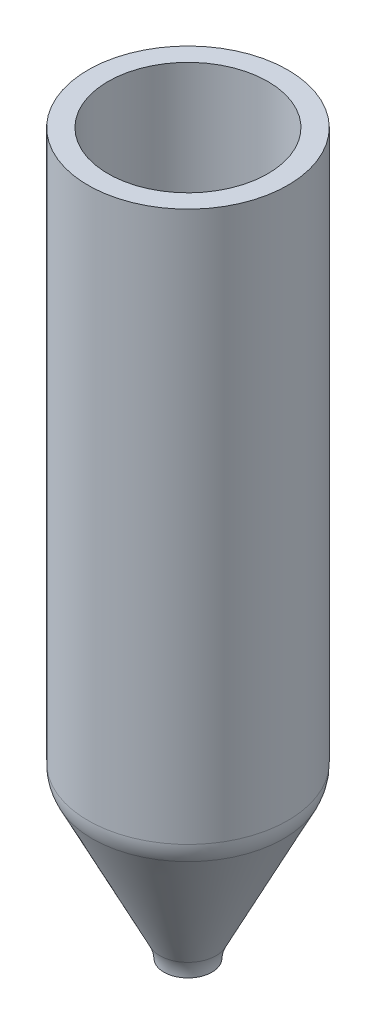
ISO-10303-21;
HEADER;
FILE_DESCRIPTION(('STEP AP214'),'2;1');
FILE_NAME('part.step','',(''),(''),'','','');
FILE_SCHEMA(('AUTOMOTIVE_DESIGN { 1 0 10303 214 1 1 1 1 }'));
ENDSEC;
DATA;
#1=APPLICATION_CONTEXT('core data for automotive mechanical design processes');
#2=APPLICATION_PROTOCOL_DEFINITION('international standard','automotive_design',2000,#1);
#3=PRODUCT_CONTEXT('',#1,'mechanical');
#4=PRODUCT('Part','Part','',(#3));
#5=PRODUCT_RELATED_PRODUCT_CATEGORY('part','',(#4));
#6=PRODUCT_DEFINITION_FORMATION('','',#4);
#7=PRODUCT_DEFINITION_CONTEXT('part definition',#1,'design');
#8=PRODUCT_DEFINITION('design','',#6,#7);
#9=PRODUCT_DEFINITION_SHAPE('','',#8);
#10=(LENGTH_UNIT() NAMED_UNIT(*) SI_UNIT(.MILLI.,.METRE.));
#11=(NAMED_UNIT(*) PLANE_ANGLE_UNIT() SI_UNIT($,.RADIAN.));
#12=(NAMED_UNIT(*) SI_UNIT($,.STERADIAN.) SOLID_ANGLE_UNIT());
#13=UNCERTAINTY_MEASURE_WITH_UNIT(LENGTH_MEASURE(1.E-05),#10,'distance_accuracy_value','');
#14=(GEOMETRIC_REPRESENTATION_CONTEXT(3) GLOBAL_UNCERTAINTY_ASSIGNED_CONTEXT((#13)) GLOBAL_UNIT_ASSIGNED_CONTEXT((#10,
#11,#12)) REPRESENTATION_CONTEXT('',''));
#15=CARTESIAN_POINT('',(0.,0.,0.));
#16=DIRECTION('',(0.,0.,1.));
#17=DIRECTION('',(1.,0.,0.));
#18=AXIS2_PLACEMENT_3D('',#15,#16,#17);
#19=CARTESIAN_POINT('',(-0.346268671593486,3.42336864947021,0.));
#20=DIRECTION('',(0.,-1.,0.));
#21=DIRECTION('',(0.,0.,-1.));
#22=AXIS2_PLACEMENT_3D('',#19,#20,#21);
#23=TOROIDAL_SURFACE('',#22,13.97,12.7);
#24=CARTESIAN_POINT('',(-0.346268671593486,3.42336864947021,0.));
#25=DIRECTION('',(0.,-1.,0.));
#26=DIRECTION('',(0.,0.,-1.));
#27=AXIS2_PLACEMENT_3D('',#24,#25,#26);
#28=CIRCLE('',#27,1.27);
#29=CARTESIAN_POINT('',(-0.346268671593486,3.42336864947021,-1.27));
#30=VERTEX_POINT('',#29);
#31=EDGE_CURVE('E69',#30,#30,#28,.T.);
#32=ORIENTED_EDGE('',*,*,#31,.T.);
#33=EDGE_LOOP('',(#32));
#34=FACE_BOUND('',#33,.T.);
#35=CARTESIAN_POINT('',(-0.346268671593486,9.1039514674368,0.));
#36=DIRECTION('',(0.,-1.,0.));
#37=DIRECTION('',(0.,0.,-1.));
#38=AXIS2_PLACEMENT_3D('',#35,#36,#37);
#39=CIRCLE('',#38,2.611259803648);
#40=CARTESIAN_POINT('',(-0.346268671593486,9.10395146743681,2.61125980364801));
#41=VERTEX_POINT('',#40);
#42=EDGE_CURVE('E10',#41,#41,#39,.T.);
#43=ORIENTED_EDGE('',*,*,#42,.F.);
#44=EDGE_LOOP('',(#43));
#45=FACE_BOUND('',#44,.T.);
#46=ADVANCED_FACE('F32',(#34,#45),#23,.T.);
#47=CARTESIAN_POINT('',(-0.346268671593486,51.9897548178547,0.));
#48=DIRECTION('',(0.,1.,0.));
#49=DIRECTION('',(0.,0.,1.));
#50=AXIS2_PLACEMENT_3D('',#47,#48,#49);
#51=CONICAL_SURFACE('',#50,24.058740196352,0.463733017627349);
#52=CARTESIAN_POINT('',(-0.346268671593486,51.9897548178547,0.));
#53=DIRECTION('',(0.,-1.,0.));
#54=DIRECTION('',(0.,0.,-1.));
#55=AXIS2_PLACEMENT_3D('',#52,#53,#54);
#56=CIRCLE('',#55,24.058740196352);
#57=CARTESIAN_POINT('',(-0.346268671593486,51.9897548178547,24.058740196352));
#58=VERTEX_POINT('',#57);
#59=EDGE_CURVE('E38',#58,#58,#56,.T.);
#60=CARTESIAN_POINT('',(-0.346268671593486,9.10395146743681,2.61125980364801));
#61=CARTESIAN_POINT('',(-0.346268671593486,9.55067858567033,2.83467105773867));
#62=CARTESIAN_POINT('',(-0.346268671593486,9.99740570390385,3.05808231182934));
#63=CARTESIAN_POINT('',(-0.346268671593486,10.8908599403709,3.50490482001067));
#64=CARTESIAN_POINT('',(-0.346268671593486,11.3375870586044,3.72831607410134));
#65=CARTESIAN_POINT('',(-0.346268671593486,12.2310412950714,4.17513858228267));
#66=CARTESIAN_POINT('',(-0.346268671593486,12.677768413305,4.39854983637334));
#67=CARTESIAN_POINT('',(-0.346268671593486,13.571222649772,4.84537234455467));
#68=CARTESIAN_POINT('',(-0.346268671593486,14.0179497680055,5.06878359864534));
#69=CARTESIAN_POINT('',(-0.346268671593486,14.9114040044726,5.51560610682667));
#70=CARTESIAN_POINT('',(-0.346268671593486,15.3581311227061,5.73901736091734));
#71=CARTESIAN_POINT('',(-0.346268671593486,16.2515853591731,6.18583986909867));
#72=CARTESIAN_POINT('',(-0.346268671593486,16.6983124774066,6.40925112318934));
#73=CARTESIAN_POINT('',(-0.346268671593486,17.5917667138737,6.85607363137067));
#74=CARTESIAN_POINT('',(-0.346268671593486,18.0384938321072,7.07948488546134));
#75=CARTESIAN_POINT('',(-0.346268671593486,18.9319480685742,7.52630739364267));
#76=CARTESIAN_POINT('',(-0.346268671593486,19.3786751868078,7.74971864773334));
#77=CARTESIAN_POINT('',(-0.346268671593486,20.2721294232748,8.19654115591467));
#78=CARTESIAN_POINT('',(-0.346268671593486,20.7188565415083,8.41995241000534));
#79=CARTESIAN_POINT('',(-0.346268671593486,21.6123107779754,8.86677491818667));
#80=CARTESIAN_POINT('',(-0.346268671593486,22.0590378962089,9.09018617227734));
#81=CARTESIAN_POINT('',(-0.346268671593486,22.9524921326759,9.53700868045867));
#82=CARTESIAN_POINT('',(-0.346268671593486,23.3992192509094,9.76041993454934));
#83=CARTESIAN_POINT('',(-0.346268671593486,24.2926734873765,10.2072424427307));
#84=CARTESIAN_POINT('',(-0.346268671593486,24.73940060561,10.4306536968213));
#85=CARTESIAN_POINT('',(-0.346268671593486,25.632854842077,10.8774762050027));
#86=CARTESIAN_POINT('',(-0.346268671593486,26.0795819603106,11.1008874590933));
#87=CARTESIAN_POINT('',(-0.346268671593486,26.9730361967776,11.5477099672747));
#88=CARTESIAN_POINT('',(-0.346268671593486,27.4197633150111,11.7711212213653));
#89=CARTESIAN_POINT('',(-0.346268671593486,28.3132175514782,12.2179437295467));
#90=CARTESIAN_POINT('',(-0.346268671593486,28.7599446697117,12.4413549836373));
#91=CARTESIAN_POINT('',(-0.346268671593486,29.6533989061787,12.8881774918187));
#92=CARTESIAN_POINT('',(-0.346268671593486,30.1001260244122,13.1115887459093));
#93=CARTESIAN_POINT('',(-0.346268671593486,30.9935802608793,13.5584112540907));
#94=CARTESIAN_POINT('',(-0.346268671593486,31.4403073791128,13.7818225081813));
#95=CARTESIAN_POINT('',(-0.346268671593486,32.3337616155798,14.2286450163627));
#96=CARTESIAN_POINT('',(-0.346268671593486,32.7804887338134,14.4520562704533));
#97=CARTESIAN_POINT('',(-0.346268671593486,33.6739429702804,14.8988787786347));
#98=CARTESIAN_POINT('',(-0.346268671593486,34.1206700885139,15.1222900327253));
#99=CARTESIAN_POINT('',(-0.346268671593486,35.014124324981,15.5691125409067));
#100=CARTESIAN_POINT('',(-0.346268671593486,35.4608514432145,15.7925237949973));
#101=CARTESIAN_POINT('',(-0.346268671593486,36.3543056796815,16.2393463031787));
#102=CARTESIAN_POINT('',(-0.346268671593486,36.801032797915,16.4627575572693));
#103=CARTESIAN_POINT('',(-0.346268671593486,37.6944870343821,16.9095800654507));
#104=CARTESIAN_POINT('',(-0.346268671593486,38.1412141526156,17.1329913195413));
#105=CARTESIAN_POINT('',(-0.346268671593486,39.0346683890826,17.5798138277227));
#106=CARTESIAN_POINT('',(-0.346268671593486,39.4813955073162,17.8032250818133));
#107=CARTESIAN_POINT('',(-0.346268671593486,40.3748497437832,18.2500475899947));
#108=CARTESIAN_POINT('',(-0.346268671593486,40.8215768620167,18.4734588440853));
#109=CARTESIAN_POINT('',(-0.346268671593486,41.7150310984838,18.9202813522667));
#110=CARTESIAN_POINT('',(-0.346268671593486,42.1617582167173,19.1436926063573));
#111=CARTESIAN_POINT('',(-0.346268671593486,43.0552124531843,19.5905151145387));
#112=CARTESIAN_POINT('',(-0.346268671593486,43.5019395714178,19.8139263686293));
#113=CARTESIAN_POINT('',(-0.346268671593486,44.3953938078849,20.2607488768107));
#114=CARTESIAN_POINT('',(-0.346268671593486,44.8421209261184,20.4841601309013));
#115=CARTESIAN_POINT('',(-0.346268671593486,45.7355751625854,20.9309826390827));
#116=CARTESIAN_POINT('',(-0.346268671593486,46.182302280819,21.1543938931733));
#117=CARTESIAN_POINT('',(-0.346268671593486,47.075756517286,21.6012164013547));
#118=CARTESIAN_POINT('',(-0.346268671593486,47.5224836355195,21.8246276554453));
#119=CARTESIAN_POINT('',(-0.346268671593486,48.4159378719866,22.2714501636267));
#120=CARTESIAN_POINT('',(-0.346268671593486,48.8626649902201,22.4948614177173));
#121=CARTESIAN_POINT('',(-0.346268671593486,49.7561192266871,22.9416839258987));
#122=CARTESIAN_POINT('',(-0.346268671593486,50.2028463449206,23.1650951799893));
#123=CARTESIAN_POINT('',(-0.346268671593486,51.0963005813877,23.6119176881707));
#124=CARTESIAN_POINT('',(-0.346268671593486,51.5430276996212,23.8353289422613));
#125=CARTESIAN_POINT('',(-0.346268671593486,51.9897548178547,24.058740196352));
#126=B_SPLINE_CURVE_WITH_KNOTS('',3,(#60,#61,#62,#63,#64,#65,#66,#67,#68,#69,#70,#71,#72,#73,
#74,#75,#76,#77,#78,#79,#80,#81,#82,#83,#84,#85,#86,#87,#88,#89,#90,#91,#92,#93,#94,#95,#96,#97,
#98,#99,#100,#101,#102,#103,#104,#105,#106,#107,#108,#109,#110,#111,#112,#113,#114,#115,#116,
#117,#118,#119,#120,#121,#122,#123,#124,#125),.UNSPECIFIED.,.F.,.F.,(4,2,2,2,2,2,2,2,2,2,2,2,2,
2,2,2,2,2,2,2,2,2,2,2,2,2,2,2,2,2,2,2,4),(0.,1.49843230063166,2.99686460126333,4.49529690189499,
5.99372920252666,7.49216150315833,8.99059380378999,10.4890261044217,11.9874584050533,
13.485890705685,14.9843230063167,16.4827553069483,17.98118760758,19.4796199082117,
20.9780522088433,22.476484509475,23.9749168101067,25.4733491107383,26.97178141137,
28.4702137120016,29.9686460126333,31.467078313265,32.9655106138966,34.4639429145283,
35.96237521516,37.4608075157916,38.9592398164233,40.457672117055,41.9561044176866,
43.4545367183183,44.95296901895,46.4514013195816,47.9498336202133),.UNSPECIFIED.);
#127=EDGE_CURVE('BSEAM87',#41,#58,#126,.T.);
#128=ORIENTED_EDGE('',*,*,#42,.T.);
#129=ORIENTED_EDGE('',*,*,#59,.F.);
#130=ORIENTED_EDGE('',*,*,#127,.T.);
#131=ORIENTED_EDGE('',*,*,#127,.F.);
#132=EDGE_LOOP('',(#128,#130,#129,#131));
#133=FACE_BOUND('',#132,.T.);
#134=ADVANCED_FACE('F87',(#133),#51,.F.);
#135=CARTESIAN_POINT('',(-0.346268671593486,57.6703376358213,0.));
#136=DIRECTION('',(0.,-1.,0.));
#137=DIRECTION('',(0.,0.,-1.));
#138=AXIS2_PLACEMENT_3D('',#135,#136,#137);
#139=TOROIDAL_SURFACE('',#138,12.7,12.7);
#140=ORIENTED_EDGE('',*,*,#59,.T.);
#141=EDGE_LOOP('',(#140));
#142=FACE_BOUND('',#141,.T.);
#143=CARTESIAN_POINT('',(-0.346268671593486,57.6703376358213,0.));
#144=DIRECTION('',(0.,-1.,0.));
#145=DIRECTION('',(0.,0.,-1.));
#146=AXIS2_PLACEMENT_3D('',#143,#144,#145);
#147=CIRCLE('',#146,25.4);
#148=CARTESIAN_POINT('',(-0.346268671593486,57.6703376358213,-25.4));
#149=VERTEX_POINT('',#148);
#150=EDGE_CURVE('E42',#149,#149,#147,.T.);
#151=ORIENTED_EDGE('',*,*,#150,.F.);
#152=EDGE_LOOP('',(#151));
#153=FACE_BOUND('',#152,.T.);
#154=ADVANCED_FACE('F91',(#142,#153),#139,.F.);
#155=CARTESIAN_POINT('',(-0.346268671593486,2.37324266445034,0.));
#156=DIRECTION('',(0.,-1.,0.));
#157=DIRECTION('',(0.,0.,-1.));
#158=AXIS2_PLACEMENT_3D('',#155,#156,#157);
#159=CYLINDRICAL_SURFACE('',#158,25.4);
#160=ORIENTED_EDGE('',*,*,#150,.T.);
#161=EDGE_LOOP('',(#160));
#162=FACE_BOUND('',#161,.T.);
#163=CARTESIAN_POINT('',(-0.346268671593486,230.972383802866,0.));
#164=DIRECTION('',(0.,-1.,0.));
#165=DIRECTION('',(0.,0.,-1.));
#166=AXIS2_PLACEMENT_3D('',#163,#164,#165);
#167=CIRCLE('',#166,25.4);
#168=CARTESIAN_POINT('',(-0.346268671593486,230.972383802866,-25.4));
#169=VERTEX_POINT('',#168);
#170=EDGE_CURVE('E46',#169,#169,#167,.T.);
#171=ORIENTED_EDGE('',*,*,#170,.F.);
#172=EDGE_LOOP('',(#171));
#173=FACE_BOUND('',#172,.T.);
#174=ADVANCED_FACE('F95',(#162,#173),#159,.F.);
#175=CARTESIAN_POINT('',(31.4037313284065,230.972383802866,0.));
#176=DIRECTION('',(0.,1.,0.));
#177=DIRECTION('',(0.,0.,1.));
#178=AXIS2_PLACEMENT_3D('',#175,#176,#177);
#179=PLANE('',#178);
#180=ORIENTED_EDGE('',*,*,#170,.T.);
#181=EDGE_LOOP('',(#180));
#182=FACE_BOUND('',#181,.T.);
#183=CARTESIAN_POINT('',(-0.346268671593486,230.972383802866,0.));
#184=DIRECTION('',(0.,-1.,0.));
#185=DIRECTION('',(0.,0.,-1.));
#186=AXIS2_PLACEMENT_3D('',#183,#184,#185);
#187=CIRCLE('',#186,31.75);
#188=CARTESIAN_POINT('',(-0.346268671593486,230.972383802866,-31.75));
#189=VERTEX_POINT('',#188);
#190=EDGE_CURVE('E51',#189,#189,#187,.T.);
#191=ORIENTED_EDGE('',*,*,#190,.F.);
#192=EDGE_LOOP('',(#191));
#193=FACE_BOUND('',#192,.T.);
#194=ADVANCED_FACE('F101',(#182,#193),#179,.T.);
#195=CARTESIAN_POINT('',(-0.346268671593486,2.37324266445034,0.));
#196=DIRECTION('',(0.,-1.,0.));
#197=DIRECTION('',(0.,0.,-1.));
#198=AXIS2_PLACEMENT_3D('',#195,#196,#197);
#199=CYLINDRICAL_SURFACE('',#198,31.75);
#200=ORIENTED_EDGE('',*,*,#190,.T.);
#201=EDGE_LOOP('',(#200));
#202=FACE_BOUND('',#201,.T.);
#203=CARTESIAN_POINT('',(-0.346268671593486,56.1710196915028,0.));
#204=DIRECTION('',(0.,-1.,0.));
#205=DIRECTION('',(0.,0.,-1.));
#206=AXIS2_PLACEMENT_3D('',#203,#204,#205);
#207=CIRCLE('',#206,31.75);
#208=CARTESIAN_POINT('',(-0.346268671593486,56.1710196915028,-31.75));
#209=VERTEX_POINT('',#208);
#210=EDGE_CURVE('E54',#209,#209,#207,.T.);
#211=ORIENTED_EDGE('',*,*,#210,.F.);
#212=EDGE_LOOP('',(#211));
#213=FACE_BOUND('',#212,.T.);
#214=ADVANCED_FACE('F105',(#202,#213),#199,.T.);
#215=CARTESIAN_POINT('',(-0.346268671593486,56.1710196915028,0.));
#216=DIRECTION('',(0.,-1.,0.));
#217=DIRECTION('',(0.,0.,-1.));
#218=AXIS2_PLACEMENT_3D('',#215,#216,#217);
#219=TOROIDAL_SURFACE('',#218,19.05,12.7);
#220=ORIENTED_EDGE('',*,*,#210,.T.);
#221=EDGE_LOOP('',(#220));
#222=FACE_BOUND('',#221,.T.);
#223=CARTESIAN_POINT('',(-0.346268671593486,50.4904368735362,0.));
#224=DIRECTION('',(0.,-1.,0.));
#225=DIRECTION('',(0.,0.,-1.));
#226=AXIS2_PLACEMENT_3D('',#223,#224,#225);
#227=CIRCLE('',#226,30.408740196352);
#228=CARTESIAN_POINT('',(-0.346268671593486,50.4904368735362,30.408740196352));
#229=VERTEX_POINT('',#228);
#230=EDGE_CURVE('E57',#229,#229,#227,.T.);
#231=ORIENTED_EDGE('',*,*,#230,.F.);
#232=EDGE_LOOP('',(#231));
#233=FACE_BOUND('',#232,.T.);
#234=ADVANCED_FACE('F109',(#222,#233),#219,.T.);
#235=CARTESIAN_POINT('',(-0.346268671593486,7.6046273361549,0.));
#236=DIRECTION('',(0.,1.,0.));
#237=DIRECTION('',(0.,0.,1.));
#238=AXIS2_PLACEMENT_3D('',#235,#236,#237);
#239=CONICAL_SURFACE('',#238,8.96125670950576,0.463733017627348);
#240=CARTESIAN_POINT('',(-0.346268671593486,7.6046273361549,0.));
#241=DIRECTION('',(0.,-1.,0.));
#242=DIRECTION('',(0.,0.,-1.));
#243=AXIS2_PLACEMENT_3D('',#240,#241,#242);
#244=CIRCLE('',#243,8.96125670950576);
#245=CARTESIAN_POINT('',(-0.346268671593486,7.60462733615491,8.96125670950576));
#246=VERTEX_POINT('',#245);
#247=EDGE_CURVE('E60',#246,#246,#244,.T.);
#248=CARTESIAN_POINT('',(-0.346268671593486,50.4904368735362,30.408740196352));
#249=CARTESIAN_POINT('',(-0.346268671593486,50.0437096908552,30.1853289100307));
#250=CARTESIAN_POINT('',(-0.346268671593486,49.5969825081741,29.9619176237094));
#251=CARTESIAN_POINT('',(-0.346268671593486,48.703528142812,29.5150950510667));
#252=CARTESIAN_POINT('',(-0.346268671593486,48.256800960131,29.2916837647454));
#253=CARTESIAN_POINT('',(-0.346268671593486,47.3633465947688,28.8448611921028));
#254=CARTESIAN_POINT('',(-0.346268671593486,46.9166194120878,28.6214499057815));
#255=CARTESIAN_POINT('',(-0.346268671593486,46.0231650467257,28.1746273331389));
#256=CARTESIAN_POINT('',(-0.346268671593486,45.5764378640446,27.9512160468175));
#257=CARTESIAN_POINT('',(-0.346268671593486,44.6829834986825,27.5043934741749));
#258=CARTESIAN_POINT('',(-0.346268671593486,44.2362563160015,27.2809821878536));
#259=CARTESIAN_POINT('',(-0.346268671593486,43.3428019506393,26.834159615211));
#260=CARTESIAN_POINT('',(-0.346268671593486,42.8960747679583,26.6107483288896));
#261=CARTESIAN_POINT('',(-0.346268671593486,42.0026204025962,26.163925756247));
#262=CARTESIAN_POINT('',(-0.346268671593486,41.5558932199151,25.9405144699257));
#263=CARTESIAN_POINT('',(-0.346268671593486,40.662438854553,25.4936918972831));
#264=CARTESIAN_POINT('',(-0.346268671593486,40.215711671872,25.2702806109618));
#265=CARTESIAN_POINT('',(-0.346268671593486,39.3222573065098,24.8234580383191));
#266=CARTESIAN_POINT('',(-0.346268671593486,38.8755301238288,24.6000467519978));
#267=CARTESIAN_POINT('',(-0.346268671593486,37.9820757584667,24.1532241793552));
#268=CARTESIAN_POINT('',(-0.346268671593486,37.5353485757856,23.9298128930339));
#269=CARTESIAN_POINT('',(-0.346268671593486,36.6418942104235,23.4829903203912));
#270=CARTESIAN_POINT('',(-0.346268671593486,36.1951670277425,23.2595790340699));
#271=CARTESIAN_POINT('',(-0.346268671593486,35.3017126623803,22.8127564614273));
#272=CARTESIAN_POINT('',(-0.346268671593486,34.8549854796993,22.589345175106));
#273=CARTESIAN_POINT('',(-0.346268671593486,33.9615311143372,22.1425226024633));
#274=CARTESIAN_POINT('',(-0.346268671593486,33.5148039316561,21.919111316142));
#275=CARTESIAN_POINT('',(-0.346268671593486,32.621349566294,21.4722887434994));
#276=CARTESIAN_POINT('',(-0.346268671593486,32.174622383613,21.2488774571781));
#277=CARTESIAN_POINT('',(-0.346268671593486,31.2811680182508,20.8020548845355));
#278=CARTESIAN_POINT('',(-0.346268671593486,30.8344408355698,20.5786435982141));
#279=CARTESIAN_POINT('',(-0.346268671593486,29.9409864702077,20.1318210255715));
#280=CARTESIAN_POINT('',(-0.346268671593486,29.4942592875266,19.9084097392502));
#281=CARTESIAN_POINT('',(-0.346268671593486,28.6008049221645,19.4615871666076));
#282=CARTESIAN_POINT('',(-0.346268671593486,28.1540777394835,19.2381758802862));
#283=CARTESIAN_POINT('',(-0.346268671593486,27.2606233741213,18.7913533076436));
#284=CARTESIAN_POINT('',(-0.346268671593486,26.8138961914403,18.5679420213223));
#285=CARTESIAN_POINT('',(-0.346268671593486,25.9204418260782,18.1211194486797));
#286=CARTESIAN_POINT('',(-0.346268671593486,25.4737146433971,17.8977081623584));
#287=CARTESIAN_POINT('',(-0.346268671593486,24.580260278035,17.4508855897157));
#288=CARTESIAN_POINT('',(-0.346268671593486,24.133533095354,17.2274743033944));
#289=CARTESIAN_POINT('',(-0.346268671593486,23.2400787299919,16.7806517307518));
#290=CARTESIAN_POINT('',(-0.346268671593486,22.7933515473108,16.5572404444305));
#291=CARTESIAN_POINT('',(-0.346268671593486,21.8998971819487,16.1104178717878));
#292=CARTESIAN_POINT('',(-0.346268671593486,21.4531699992676,15.8870065854665));
#293=CARTESIAN_POINT('',(-0.346268671593486,20.5597156339055,15.4401840128239));
#294=CARTESIAN_POINT('',(-0.346268671593486,20.1129884512245,15.2167727265026));
#295=CARTESIAN_POINT('',(-0.346268671593486,19.2195340858623,14.7699501538599));
#296=CARTESIAN_POINT('',(-0.346268671593486,18.7728069031813,14.5465388675386));
#297=CARTESIAN_POINT('',(-0.346268671593486,17.8793525378192,14.099716294896));
#298=CARTESIAN_POINT('',(-0.346268671593486,17.4326253551381,13.8763050085747));
#299=CARTESIAN_POINT('',(-0.346268671593486,16.539170989776,13.4294824359321));
#300=CARTESIAN_POINT('',(-0.346268671593486,16.092443807095,13.2060711496107));
#301=CARTESIAN_POINT('',(-0.346268671593486,15.1989894417329,12.7592485769681));
#302=CARTESIAN_POINT('',(-0.346268671593486,14.7522622590518,12.5358372906468));
#303=CARTESIAN_POINT('',(-0.346268671593486,13.8588078936897,12.0890147180042));
#304=CARTESIAN_POINT('',(-0.346268671593486,13.4120807110086,11.8656034316829));
#305=CARTESIAN_POINT('',(-0.346268671593486,12.5186263456465,11.4187808590402));
#306=CARTESIAN_POINT('',(-0.346268671593486,12.0718991629655,11.1953695727189));
#307=CARTESIAN_POINT('',(-0.346268671593486,11.1784447976033,10.7485470000763));
#308=CARTESIAN_POINT('',(-0.346268671593486,10.7317176149223,10.525135713755));
#309=CARTESIAN_POINT('',(-0.346268671593486,9.83826324956018,10.0783131411123));
#310=CARTESIAN_POINT('',(-0.346268671593486,9.39153606687913,9.85490185479102));
#311=CARTESIAN_POINT('',(-0.346268671593486,8.49808170151702,9.40807928214839));
#312=CARTESIAN_POINT('',(-0.346268671593486,8.05135451883596,9.18466799582707));
#313=CARTESIAN_POINT('',(-0.346268671593486,7.6046273361549,8.96125670950576));
#314=B_SPLINE_CURVE_WITH_KNOTS('',3,(#248,#249,#250,#251,#252,#253,#254,#255,#256,#257,#258,
#259,#260,#261,#262,#263,#264,#265,#266,#267,#268,#269,#270,#271,#272,#273,#274,#275,#276,#277,
#278,#279,#280,#281,#282,#283,#284,#285,#286,#287,#288,#289,#290,#291,#292,#293,#294,#295,#296,
#297,#298,#299,#300,#301,#302,#303,#304,#305,#306,#307,#308,#309,#310,#311,#312,#313),
.UNSPECIFIED.,.F.,.F.,(4,2,2,2,2,2,2,2,2,2,2,2,2,2,2,2,2,2,2,2,2,2,2,2,2,2,2,2,2,2,2,2,4),(0.,
1.49843251680451,2.99686503360901,4.49529755041351,5.99373006721801,7.49216258402252,
8.99059510082702,10.4890276176315,11.987460134436,13.4858926512405,14.984325168045,
16.4827576848495,17.981190201654,19.4796227184586,20.9780552352631,22.4764877520676,
23.9749202688721,25.4733527856766,26.9717853024811,28.4702178192856,29.9686503360901,
31.4670828528946,32.9655153696991,34.4639478865036,35.9623804033081,37.4608129201126,
38.9592454369171,40.4576779537216,41.9561104705261,43.4545429873306,44.9529755041351,
46.4514080209396,47.9498405377441),.UNSPECIFIED.);
#315=EDGE_CURVE('BSEAM113',#229,#246,#314,.T.);
#316=ORIENTED_EDGE('',*,*,#230,.T.);
#317=ORIENTED_EDGE('',*,*,#247,.F.);
#318=ORIENTED_EDGE('',*,*,#315,.T.);
#319=ORIENTED_EDGE('',*,*,#315,.F.);
#320=EDGE_LOOP('',(#316,#318,#317,#319));
#321=FACE_BOUND('',#320,.T.);
#322=ADVANCED_FACE('F113',(#321),#239,.T.);
#323=CARTESIAN_POINT('',(-0.346268671593486,1.92404451818831,0.));
#324=DIRECTION('',(0.,-1.,0.));
#325=DIRECTION('',(0.,0.,-1.));
#326=AXIS2_PLACEMENT_3D('',#323,#324,#325);
#327=TOROIDAL_SURFACE('',#326,20.3199969058578,12.7);
#328=ORIENTED_EDGE('',*,*,#247,.T.);
#329=EDGE_LOOP('',(#328));
#330=FACE_BOUND('',#329,.T.);
#331=CARTESIAN_POINT('',(-0.346268671593486,2.37238380286577,0.));
#332=DIRECTION('',(0.,-1.,0.));
#333=DIRECTION('',(0.,0.,-1.));
#334=AXIS2_PLACEMENT_3D('',#331,#332,#333);
#335=CIRCLE('',#334,7.62791307829757);
#336=CARTESIAN_POINT('',(-0.346268671593486,2.37238380286577,-7.62791307829757));
#337=VERTEX_POINT('',#336);
#338=EDGE_CURVE('E63',#337,#337,#335,.T.);
#339=ORIENTED_EDGE('',*,*,#338,.F.);
#340=EDGE_LOOP('',(#339));
#341=FACE_BOUND('',#340,.T.);
#342=ADVANCED_FACE('F83',(#330,#341),#327,.F.);
#343=CARTESIAN_POINT('',(0.923731328406514,2.37238380286577,0.));
#344=DIRECTION('',(0.,-1.,0.));
#345=DIRECTION('',(0.,0.,-1.));
#346=AXIS2_PLACEMENT_3D('',#343,#344,#345);
#347=PLANE('',#346);
#348=ORIENTED_EDGE('',*,*,#338,.T.);
#349=EDGE_LOOP('',(#348));
#350=FACE_BOUND('',#349,.T.);
#351=CARTESIAN_POINT('',(-0.346268671593486,2.37238380286577,0.));
#352=DIRECTION('',(0.,-1.,0.));
#353=DIRECTION('',(0.,0.,-1.));
#354=AXIS2_PLACEMENT_3D('',#351,#352,#353);
#355=CIRCLE('',#354,1.27);
#356=CARTESIAN_POINT('',(-0.346268671593486,2.37238380286577,-1.27));
#357=VERTEX_POINT('',#356);
#358=EDGE_CURVE('E66',#357,#357,#355,.T.);
#359=ORIENTED_EDGE('',*,*,#358,.F.);
#360=EDGE_LOOP('',(#359));
#361=FACE_BOUND('',#360,.T.);
#362=ADVANCED_FACE('F77',(#350,#361),#347,.T.);
#363=CARTESIAN_POINT('',(-0.346268671593486,2.37324266445034,0.));
#364=DIRECTION('',(0.,-1.,0.));
#365=DIRECTION('',(0.,0.,-1.));
#366=AXIS2_PLACEMENT_3D('',#363,#364,#365);
#367=CYLINDRICAL_SURFACE('',#366,1.27);
#368=ORIENTED_EDGE('',*,*,#358,.T.);
#369=EDGE_LOOP('',(#368));
#370=FACE_BOUND('',#369,.T.);
#371=ORIENTED_EDGE('',*,*,#31,.F.);
#372=EDGE_LOOP('',(#371));
#373=FACE_BOUND('',#372,.T.);
#374=ADVANCED_FACE('F75',(#370,#373),#367,.F.);
#375=CLOSED_SHELL('',(#46,#134,#154,#174,#194,#214,#234,#322,#342,#362,#374));
#376=MANIFOLD_SOLID_BREP('B2',#375);
#377=ADVANCED_BREP_SHAPE_REPRESENTATION('',(#18,#376),#14);
#378=SHAPE_DEFINITION_REPRESENTATION(#9,#377);
ENDSEC;
END-ISO-10303-21;
